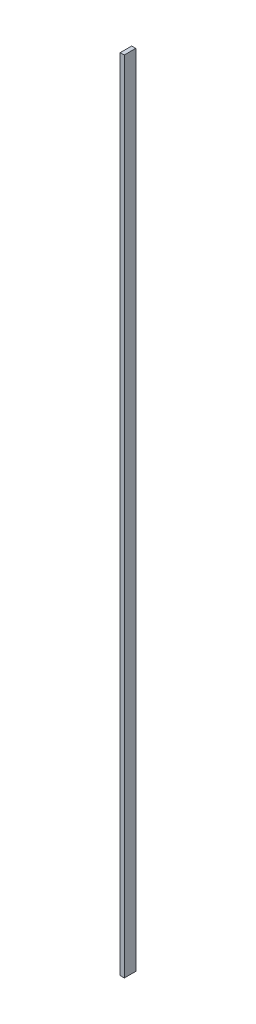
ISO-10303-21;
HEADER;
FILE_DESCRIPTION(('STEP AP214'),'2;1');
FILE_NAME('part.step','',(''),(''),'','','');
FILE_SCHEMA(('AUTOMOTIVE_DESIGN { 1 0 10303 214 1 1 1 1 }'));
ENDSEC;
DATA;
#1=APPLICATION_CONTEXT('core data for automotive mechanical design processes');
#2=APPLICATION_PROTOCOL_DEFINITION('international standard','automotive_design',2000,#1);
#3=PRODUCT_CONTEXT('',#1,'mechanical');
#4=PRODUCT('Part','Part','',(#3));
#5=PRODUCT_RELATED_PRODUCT_CATEGORY('part','',(#4));
#6=PRODUCT_DEFINITION_FORMATION('','',#4);
#7=PRODUCT_DEFINITION_CONTEXT('part definition',#1,'design');
#8=PRODUCT_DEFINITION('design','',#6,#7);
#9=PRODUCT_DEFINITION_SHAPE('','',#8);
#10=(LENGTH_UNIT() NAMED_UNIT(*) SI_UNIT(.MILLI.,.METRE.));
#11=(NAMED_UNIT(*) PLANE_ANGLE_UNIT() SI_UNIT($,.RADIAN.));
#12=(NAMED_UNIT(*) SI_UNIT($,.STERADIAN.) SOLID_ANGLE_UNIT());
#13=UNCERTAINTY_MEASURE_WITH_UNIT(LENGTH_MEASURE(1.E-05),#10,'distance_accuracy_value','');
#14=(GEOMETRIC_REPRESENTATION_CONTEXT(3) GLOBAL_UNCERTAINTY_ASSIGNED_CONTEXT((#13)) GLOBAL_UNIT_ASSIGNED_CONTEXT((#10,
#11,#12)) REPRESENTATION_CONTEXT('',''));
#15=CARTESIAN_POINT('',(0.,0.,0.));
#16=DIRECTION('',(0.,0.,1.));
#17=DIRECTION('',(1.,0.,0.));
#18=AXIS2_PLACEMENT_3D('',#15,#16,#17);
#19=CARTESIAN_POINT('',(745.,0.,70.));
#20=DIRECTION('',(0.,-1.,0.));
#21=DIRECTION('',(1.,0.,0.));
#22=AXIS2_PLACEMENT_3D('',#19,#20,#21);
#23=PLANE('',#22);
#24=DIRECTION('',(-1.,0.,0.));
#25=VECTOR('',#24,1.);
#26=CARTESIAN_POINT('',(745.,0.,0.));
#27=LINE('',#26,#25);
#28=CARTESIAN_POINT('',(745.,0.,0.));
#29=VERTEX_POINT('',#28);
#30=CARTESIAN_POINT('',(720.,0.,0.));
#31=VERTEX_POINT('',#30);
#32=EDGE_CURVE('E83',#29,#31,#27,.T.);
#33=ORIENTED_EDGE('',*,*,#32,.T.);
#34=DIRECTION('',(0.,0.,-1.));
#35=VECTOR('',#34,1.);
#36=CARTESIAN_POINT('',(720.,0.,70.));
#37=LINE('',#36,#35);
#38=CARTESIAN_POINT('',(720.,0.,70.));
#39=VERTEX_POINT('',#38);
#40=EDGE_CURVE('E85',#39,#31,#37,.T.);
#41=ORIENTED_EDGE('',*,*,#40,.F.);
#42=DIRECTION('',(-1.,0.,0.));
#43=VECTOR('',#42,1.);
#44=CARTESIAN_POINT('',(745.,0.,70.));
#45=LINE('',#44,#43);
#46=CARTESIAN_POINT('',(745.,0.,70.));
#47=VERTEX_POINT('',#46);
#48=EDGE_CURVE('E101',#47,#39,#45,.T.);
#49=ORIENTED_EDGE('',*,*,#48,.F.);
#50=DIRECTION('',(0.,0.,-1.));
#51=VECTOR('',#50,1.);
#52=CARTESIAN_POINT('',(745.,0.,70.));
#53=LINE('',#52,#51);
#54=EDGE_CURVE('E80',#47,#29,#53,.T.);
#55=ORIENTED_EDGE('',*,*,#54,.T.);
#56=EDGE_LOOP('',(#33,#41,#49,#55));
#57=FACE_BOUND('',#56,.T.);
#58=ADVANCED_FACE('F33',(#57),#23,.F.);
#59=CARTESIAN_POINT('',(720.,0.,70.));
#60=DIRECTION('',(1.,0.,0.));
#61=DIRECTION('',(0.,1.,0.));
#62=AXIS2_PLACEMENT_3D('',#59,#60,#61);
#63=PLANE('',#62);
#64=DIRECTION('',(0.,-1.,0.));
#65=VECTOR('',#64,1.);
#66=CARTESIAN_POINT('',(720.,0.,0.));
#67=LINE('',#66,#65);
#68=CARTESIAN_POINT('',(720.,-4897.,0.));
#69=VERTEX_POINT('',#68);
#70=EDGE_CURVE('E88',#31,#69,#67,.T.);
#71=ORIENTED_EDGE('',*,*,#70,.T.);
#72=DIRECTION('',(0.,0.,-1.));
#73=VECTOR('',#72,1.);
#74=CARTESIAN_POINT('',(720.,-4897.,70.));
#75=LINE('',#74,#73);
#76=CARTESIAN_POINT('',(720.,-4897.,70.));
#77=VERTEX_POINT('',#76);
#78=EDGE_CURVE('E93',#77,#69,#75,.T.);
#79=ORIENTED_EDGE('',*,*,#78,.F.);
#80=DIRECTION('',(0.,-1.,0.));
#81=VECTOR('',#80,1.);
#82=CARTESIAN_POINT('',(720.,0.,70.));
#83=LINE('',#82,#81);
#84=EDGE_CURVE('E69',#39,#77,#83,.T.);
#85=ORIENTED_EDGE('',*,*,#84,.F.);
#86=ORIENTED_EDGE('',*,*,#40,.T.);
#87=EDGE_LOOP('',(#71,#79,#85,#86));
#88=FACE_BOUND('',#87,.T.);
#89=ADVANCED_FACE('F91',(#88),#63,.F.);
#90=CARTESIAN_POINT('',(720.,-4897.,70.));
#91=DIRECTION('',(0.,1.,0.));
#92=DIRECTION('',(0.,0.,1.));
#93=AXIS2_PLACEMENT_3D('',#90,#91,#92);
#94=PLANE('',#93);
#95=DIRECTION('',(1.,0.,0.));
#96=VECTOR('',#95,1.);
#97=CARTESIAN_POINT('',(720.,-4897.,0.));
#98=LINE('',#97,#96);
#99=CARTESIAN_POINT('',(745.,-4897.,0.));
#100=VERTEX_POINT('',#99);
#101=EDGE_CURVE('E43',#69,#100,#98,.T.);
#102=ORIENTED_EDGE('',*,*,#101,.T.);
#103=DIRECTION('',(0.,0.,-1.));
#104=VECTOR('',#103,1.);
#105=CARTESIAN_POINT('',(745.,-4897.,70.));
#106=LINE('',#105,#104);
#107=CARTESIAN_POINT('',(745.,-4897.,70.));
#108=VERTEX_POINT('',#107);
#109=EDGE_CURVE('E52',#108,#100,#106,.T.);
#110=ORIENTED_EDGE('',*,*,#109,.F.);
#111=DIRECTION('',(1.,0.,0.));
#112=VECTOR('',#111,1.);
#113=CARTESIAN_POINT('',(720.,-4897.,70.));
#114=LINE('',#113,#112);
#115=EDGE_CURVE('E74',#77,#108,#114,.T.);
#116=ORIENTED_EDGE('',*,*,#115,.F.);
#117=ORIENTED_EDGE('',*,*,#78,.T.);
#118=EDGE_LOOP('',(#102,#110,#116,#117));
#119=FACE_BOUND('',#118,.T.);
#120=ADVANCED_FACE('F105',(#119),#94,.F.);
#121=CARTESIAN_POINT('',(0.,0.,70.));
#122=DIRECTION('',(0.,0.,1.));
#123=DIRECTION('',(1.,0.,0.));
#124=AXIS2_PLACEMENT_3D('',#121,#122,#123);
#125=PLANE('',#124);
#126=DIRECTION('',(0.,-1.,0.));
#127=VECTOR('',#126,1.);
#128=CARTESIAN_POINT('',(745.,0.,70.));
#129=LINE('',#128,#127);
#130=EDGE_CURVE('E37',#47,#108,#129,.T.);
#131=ORIENTED_EDGE('',*,*,#130,.F.);
#132=ORIENTED_EDGE('',*,*,#48,.T.);
#133=ORIENTED_EDGE('',*,*,#84,.T.);
#134=ORIENTED_EDGE('',*,*,#115,.T.);
#135=EDGE_LOOP('',(#131,#132,#133,#134));
#136=FACE_BOUND('',#135,.T.);
#137=ADVANCED_FACE('F35',(#136),#125,.T.);
#138=CARTESIAN_POINT('',(0.,0.,0.));
#139=DIRECTION('',(0.,0.,1.));
#140=DIRECTION('',(1.,0.,0.));
#141=AXIS2_PLACEMENT_3D('',#138,#139,#140);
#142=PLANE('',#141);
#143=DIRECTION('',(0.,-1.,0.));
#144=VECTOR('',#143,1.);
#145=CARTESIAN_POINT('',(745.,0.,0.));
#146=LINE('',#145,#144);
#147=EDGE_CURVE('E11',#29,#100,#146,.T.);
#148=ORIENTED_EDGE('',*,*,#147,.T.);
#149=ORIENTED_EDGE('',*,*,#101,.F.);
#150=ORIENTED_EDGE('',*,*,#70,.F.);
#151=ORIENTED_EDGE('',*,*,#32,.F.);
#152=EDGE_LOOP('',(#148,#149,#150,#151));
#153=FACE_BOUND('',#152,.T.);
#154=ADVANCED_FACE('F96',(#153),#142,.F.);
#155=CARTESIAN_POINT('',(745.,0.,70.));
#156=DIRECTION('',(1.,0.,0.));
#157=DIRECTION('',(0.,1.,0.));
#158=AXIS2_PLACEMENT_3D('',#155,#156,#157);
#159=PLANE('',#158);
#160=ORIENTED_EDGE('',*,*,#147,.F.);
#161=ORIENTED_EDGE('',*,*,#54,.F.);
#162=ORIENTED_EDGE('',*,*,#130,.T.);
#163=ORIENTED_EDGE('',*,*,#109,.T.);
#164=EDGE_LOOP('',(#160,#161,#162,#163));
#165=FACE_BOUND('',#164,.T.);
#166=ADVANCED_FACE('F103',(#165),#159,.T.);
#167=CLOSED_SHELL('',(#58,#89,#120,#137,#154,#166));
#168=MANIFOLD_SOLID_BREP('B2',#167);
#169=ADVANCED_BREP_SHAPE_REPRESENTATION('',(#18,#168),#14);
#170=SHAPE_DEFINITION_REPRESENTATION(#9,#169);
ENDSEC;
END-ISO-10303-21;
